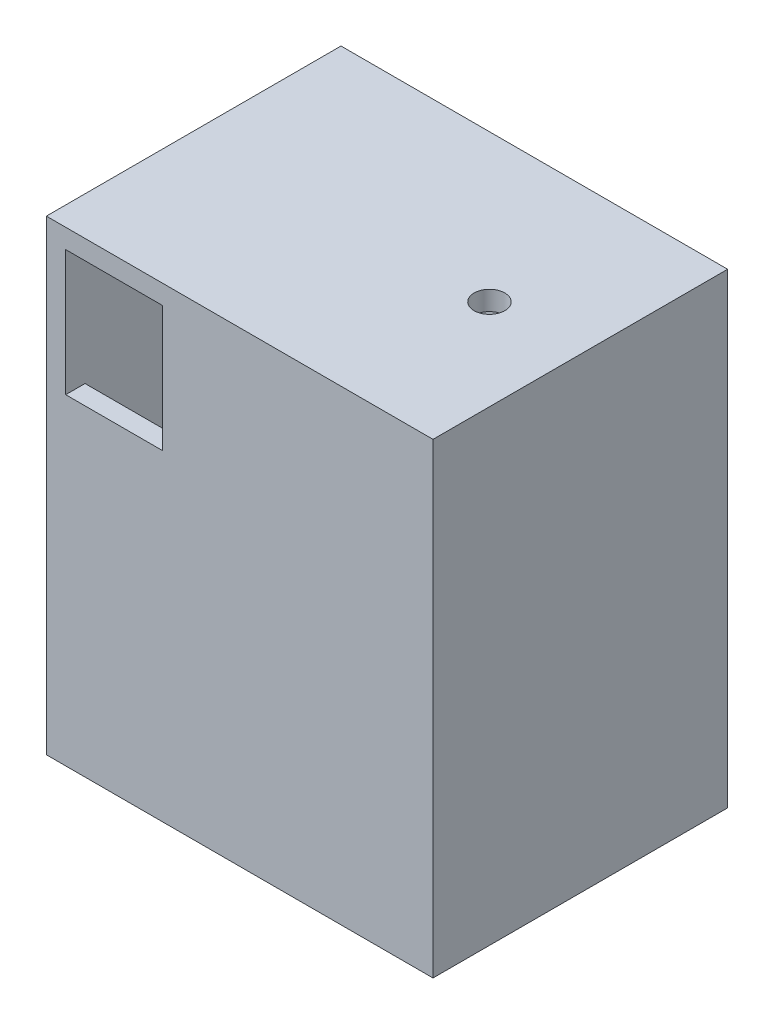
ISO-10303-21;
HEADER;
FILE_DESCRIPTION(('STEP AP214'),'2;1');
FILE_NAME('part.step','',(''),(''),'','','');
FILE_SCHEMA(('AUTOMOTIVE_DESIGN { 1 0 10303 214 1 1 1 1 }'));
ENDSEC;
DATA;
#1=APPLICATION_CONTEXT('core data for automotive mechanical design processes');
#2=APPLICATION_PROTOCOL_DEFINITION('international standard','automotive_design',2000,#1);
#3=PRODUCT_CONTEXT('',#1,'mechanical');
#4=PRODUCT('Part','Part','',(#3));
#5=PRODUCT_RELATED_PRODUCT_CATEGORY('part','',(#4));
#6=PRODUCT_DEFINITION_FORMATION('','',#4);
#7=PRODUCT_DEFINITION_CONTEXT('part definition',#1,'design');
#8=PRODUCT_DEFINITION('design','',#6,#7);
#9=PRODUCT_DEFINITION_SHAPE('','',#8);
#10=(LENGTH_UNIT() NAMED_UNIT(*) SI_UNIT(.MILLI.,.METRE.));
#11=(NAMED_UNIT(*) PLANE_ANGLE_UNIT() SI_UNIT($,.RADIAN.));
#12=(NAMED_UNIT(*) SI_UNIT($,.STERADIAN.) SOLID_ANGLE_UNIT());
#13=UNCERTAINTY_MEASURE_WITH_UNIT(LENGTH_MEASURE(1.E-05),#10,'distance_accuracy_value','');
#14=(GEOMETRIC_REPRESENTATION_CONTEXT(3) GLOBAL_UNCERTAINTY_ASSIGNED_CONTEXT((#13)) GLOBAL_UNIT_ASSIGNED_CONTEXT((#10,
#11,#12)) REPRESENTATION_CONTEXT('',''));
#15=CARTESIAN_POINT('',(0.,0.,0.));
#16=DIRECTION('',(0.,0.,1.));
#17=DIRECTION('',(1.,0.,0.));
#18=AXIS2_PLACEMENT_3D('',#15,#16,#17);
#19=CARTESIAN_POINT('',(-200.,482.6,-152.4));
#20=DIRECTION('',(0.,0.,-1.));
#21=DIRECTION('',(-1.,0.,0.));
#22=AXIS2_PLACEMENT_3D('',#19,#20,#21);
#23=PLANE('',#22);
#24=DIRECTION('',(1.,0.,0.));
#25=VECTOR('',#24,1.);
#26=CARTESIAN_POINT('',(-200.,0.,-152.4));
#27=LINE('',#26,#25);
#28=CARTESIAN_POINT('',(-200.,0.,-152.4));
#29=VERTEX_POINT('',#28);
#30=CARTESIAN_POINT('',(200.,0.,-152.4));
#31=VERTEX_POINT('',#30);
#32=EDGE_CURVE('E197',#29,#31,#27,.T.);
#33=ORIENTED_EDGE('',*,*,#32,.F.);
#34=DIRECTION('',(0.,-1.,0.));
#35=VECTOR('',#34,1.);
#36=CARTESIAN_POINT('',(-200.,482.6,-152.4));
#37=LINE('',#36,#35);
#38=CARTESIAN_POINT('',(-200.,482.6,-152.4));
#39=VERTEX_POINT('',#38);
#40=EDGE_CURVE('E219',#39,#29,#37,.T.);
#41=ORIENTED_EDGE('',*,*,#40,.F.);
#42=DIRECTION('',(1.,0.,0.));
#43=VECTOR('',#42,1.);
#44=CARTESIAN_POINT('',(-200.,482.6,-152.4));
#45=LINE('',#44,#43);
#46=CARTESIAN_POINT('',(200.,482.6,-152.4));
#47=VERTEX_POINT('',#46);
#48=EDGE_CURVE('E198',#39,#47,#45,.T.);
#49=ORIENTED_EDGE('',*,*,#48,.T.);
#50=DIRECTION('',(0.,-1.,0.));
#51=VECTOR('',#50,1.);
#52=CARTESIAN_POINT('',(200.,482.6,-152.4));
#53=LINE('',#52,#51);
#54=EDGE_CURVE('E209',#47,#31,#53,.T.);
#55=ORIENTED_EDGE('',*,*,#54,.T.);
#56=EDGE_LOOP('',(#33,#41,#49,#55));
#57=FACE_BOUND('',#56,.T.);
#58=ADVANCED_FACE('F35',(#57),#23,.T.);
#59=CARTESIAN_POINT('',(-200.,482.6,-152.4));
#60=DIRECTION('',(1.,0.,0.));
#61=DIRECTION('',(0.,0.,-1.));
#62=AXIS2_PLACEMENT_3D('',#59,#60,#61);
#63=PLANE('',#62);
#64=DIRECTION('',(0.,0.,1.));
#65=VECTOR('',#64,1.);
#66=CARTESIAN_POINT('',(-200.,0.,-152.4));
#67=LINE('',#66,#65);
#68=CARTESIAN_POINT('',(-200.,0.,152.4));
#69=VERTEX_POINT('',#68);
#70=EDGE_CURVE('E202',#29,#69,#67,.T.);
#71=ORIENTED_EDGE('',*,*,#70,.T.);
#72=DIRECTION('',(0.,-1.,0.));
#73=VECTOR('',#72,1.);
#74=CARTESIAN_POINT('',(-200.,482.6,152.4));
#75=LINE('',#74,#73);
#76=CARTESIAN_POINT('',(-200.,482.6,152.4));
#77=VERTEX_POINT('',#76);
#78=EDGE_CURVE('E222',#77,#69,#75,.T.);
#79=ORIENTED_EDGE('',*,*,#78,.F.);
#80=DIRECTION('',(0.,0.,1.));
#81=VECTOR('',#80,1.);
#82=CARTESIAN_POINT('',(-200.,482.6,-152.4));
#83=LINE('',#82,#81);
#84=EDGE_CURVE('E207',#39,#77,#83,.T.);
#85=ORIENTED_EDGE('',*,*,#84,.F.);
#86=ORIENTED_EDGE('',*,*,#40,.T.);
#87=EDGE_LOOP('',(#71,#79,#85,#86));
#88=FACE_BOUND('',#87,.T.);
#89=ADVANCED_FACE('F282',(#88),#63,.F.);
#90=CARTESIAN_POINT('',(-200.,482.6,152.4));
#91=DIRECTION('',(0.,0.,-1.));
#92=DIRECTION('',(-1.,0.,0.));
#93=AXIS2_PLACEMENT_3D('',#90,#91,#92);
#94=PLANE('',#93);
#95=DIRECTION('',(1.,0.,0.));
#96=VECTOR('',#95,1.);
#97=CARTESIAN_POINT('',(-180.,332.6,152.4));
#98=LINE('',#97,#96);
#99=CARTESIAN_POINT('',(-180.,332.6,152.4));
#100=VERTEX_POINT('',#99);
#101=CARTESIAN_POINT('',(-80.,332.6,152.4));
#102=VERTEX_POINT('',#101);
#103=EDGE_CURVE('E172',#100,#102,#98,.T.);
#104=ORIENTED_EDGE('',*,*,#103,.F.);
#105=DIRECTION('',(0.,-1.,0.));
#106=VECTOR('',#105,1.);
#107=CARTESIAN_POINT('',(-180.,462.6,152.4));
#108=LINE('',#107,#106);
#109=CARTESIAN_POINT('',(-180.,462.6,152.4));
#110=VERTEX_POINT('',#109);
#111=EDGE_CURVE('E168',#110,#100,#108,.T.);
#112=ORIENTED_EDGE('',*,*,#111,.F.);
#113=DIRECTION('',(-1.,0.,0.));
#114=VECTOR('',#113,1.);
#115=CARTESIAN_POINT('',(-180.,462.6,152.4));
#116=LINE('',#115,#114);
#117=CARTESIAN_POINT('',(-80.,462.6,152.4));
#118=VERTEX_POINT('',#117);
#119=EDGE_CURVE('E178',#118,#110,#116,.T.);
#120=ORIENTED_EDGE('',*,*,#119,.F.);
#121=DIRECTION('',(0.,1.,0.));
#122=VECTOR('',#121,1.);
#123=CARTESIAN_POINT('',(-80.,462.6,152.4));
#124=LINE('',#123,#122);
#125=EDGE_CURVE('E175',#102,#118,#124,.T.);
#126=ORIENTED_EDGE('',*,*,#125,.F.);
#127=EDGE_LOOP('',(#104,#112,#120,#126));
#128=FACE_BOUND('',#127,.T.);
#129=DIRECTION('',(1.,0.,0.));
#130=VECTOR('',#129,1.);
#131=CARTESIAN_POINT('',(-200.,0.,152.4));
#132=LINE('',#131,#130);
#133=CARTESIAN_POINT('',(200.,0.,152.4));
#134=VERTEX_POINT('',#133);
#135=EDGE_CURVE('E215',#69,#134,#132,.T.);
#136=ORIENTED_EDGE('',*,*,#135,.T.);
#137=DIRECTION('',(0.,-1.,0.));
#138=VECTOR('',#137,1.);
#139=CARTESIAN_POINT('',(200.,482.6,152.4));
#140=LINE('',#139,#138);
#141=CARTESIAN_POINT('',(200.,482.6,152.4));
#142=VERTEX_POINT('',#141);
#143=EDGE_CURVE('E225',#142,#134,#140,.T.);
#144=ORIENTED_EDGE('',*,*,#143,.F.);
#145=DIRECTION('',(1.,0.,0.));
#146=VECTOR('',#145,1.);
#147=CARTESIAN_POINT('',(-200.,482.6,152.4));
#148=LINE('',#147,#146);
#149=EDGE_CURVE('E205',#77,#142,#148,.T.);
#150=ORIENTED_EDGE('',*,*,#149,.F.);
#151=ORIENTED_EDGE('',*,*,#78,.T.);
#152=EDGE_LOOP('',(#136,#144,#150,#151));
#153=FACE_BOUND('',#152,.T.);
#154=ADVANCED_FACE('F288',(#128,#153),#94,.F.);
#155=CARTESIAN_POINT('',(200.,482.6,-152.4));
#156=DIRECTION('',(1.,0.,0.));
#157=DIRECTION('',(0.,0.,-1.));
#158=AXIS2_PLACEMENT_3D('',#155,#156,#157);
#159=PLANE('',#158);
#160=DIRECTION('',(0.,0.,1.));
#161=VECTOR('',#160,1.);
#162=CARTESIAN_POINT('',(200.,0.,-152.4));
#163=LINE('',#162,#161);
#164=EDGE_CURVE('E212',#31,#134,#163,.T.);
#165=ORIENTED_EDGE('',*,*,#164,.F.);
#166=ORIENTED_EDGE('',*,*,#54,.F.);
#167=DIRECTION('',(0.,0.,1.));
#168=VECTOR('',#167,1.);
#169=CARTESIAN_POINT('',(200.,482.6,-152.4));
#170=LINE('',#169,#168);
#171=EDGE_CURVE('E201',#47,#142,#170,.T.);
#172=ORIENTED_EDGE('',*,*,#171,.T.);
#173=ORIENTED_EDGE('',*,*,#143,.T.);
#174=EDGE_LOOP('',(#165,#166,#172,#173));
#175=FACE_BOUND('',#174,.T.);
#176=ADVANCED_FACE('F294',(#175),#159,.T.);
#177=CARTESIAN_POINT('',(0.,482.6,0.));
#178=DIRECTION('',(0.,-1.,0.));
#179=DIRECTION('',(0.,0.,-1.));
#180=AXIS2_PLACEMENT_3D('',#177,#178,#179);
#181=PLANE('',#180);
#182=CARTESIAN_POINT('',(106.,482.6,0.));
#183=DIRECTION('',(0.,1.,0.));
#184=DIRECTION('',(0.,0.,1.));
#185=AXIS2_PLACEMENT_3D('',#182,#183,#184);
#186=CIRCLE('',#185,15.9047003075628);
#187=CARTESIAN_POINT('',(106.,482.6,15.9047003075628));
#188=VERTEX_POINT('',#187);
#189=EDGE_CURVE('E194',#188,#188,#186,.T.);
#190=ORIENTED_EDGE('',*,*,#189,.F.);
#191=EDGE_LOOP('',(#190));
#192=FACE_BOUND('',#191,.T.);
#193=ORIENTED_EDGE('',*,*,#48,.F.);
#194=ORIENTED_EDGE('',*,*,#84,.T.);
#195=ORIENTED_EDGE('',*,*,#149,.T.);
#196=ORIENTED_EDGE('',*,*,#171,.F.);
#197=EDGE_LOOP('',(#193,#194,#195,#196));
#198=FACE_BOUND('',#197,.T.);
#199=ADVANCED_FACE('F328',(#192,#198),#181,.F.);
#200=CARTESIAN_POINT('',(0.,0.,0.));
#201=DIRECTION('',(0.,-1.,0.));
#202=DIRECTION('',(0.,0.,-1.));
#203=AXIS2_PLACEMENT_3D('',#200,#201,#202);
#204=PLANE('',#203);
#205=DIRECTION('',(0.,0.,1.));
#206=VECTOR('',#205,1.);
#207=CARTESIAN_POINT('',(-30.,0.,40.));
#208=LINE('',#207,#206);
#209=CARTESIAN_POINT('',(-30.,0.,-40.));
#210=VERTEX_POINT('',#209);
#211=CARTESIAN_POINT('',(-30.,0.,40.));
#212=VERTEX_POINT('',#211);
#213=EDGE_CURVE('E50',#210,#212,#208,.T.);
#214=ORIENTED_EDGE('',*,*,#213,.F.);
#215=DIRECTION('',(1.,0.,0.));
#216=VECTOR('',#215,1.);
#217=CARTESIAN_POINT('',(-90.,0.,-40.));
#218=LINE('',#217,#216);
#219=CARTESIAN_POINT('',(-90.,0.,-40.));
#220=VERTEX_POINT('',#219);
#221=EDGE_CURVE('E161',#220,#210,#218,.T.);
#222=ORIENTED_EDGE('',*,*,#221,.F.);
#223=DIRECTION('',(0.,0.,-1.));
#224=VECTOR('',#223,1.);
#225=CARTESIAN_POINT('',(-90.,0.,40.));
#226=LINE('',#225,#224);
#227=CARTESIAN_POINT('',(-90.,0.,40.));
#228=VERTEX_POINT('',#227);
#229=EDGE_CURVE('E145',#228,#220,#226,.T.);
#230=ORIENTED_EDGE('',*,*,#229,.F.);
#231=DIRECTION('',(-1.,0.,0.));
#232=VECTOR('',#231,1.);
#233=CARTESIAN_POINT('',(-90.,0.,40.));
#234=LINE('',#233,#232);
#235=EDGE_CURVE('E154',#212,#228,#234,.T.);
#236=ORIENTED_EDGE('',*,*,#235,.F.);
#237=EDGE_LOOP('',(#214,#222,#230,#236));
#238=FACE_BOUND('',#237,.T.);
#239=ORIENTED_EDGE('',*,*,#32,.T.);
#240=ORIENTED_EDGE('',*,*,#164,.T.);
#241=ORIENTED_EDGE('',*,*,#135,.F.);
#242=ORIENTED_EDGE('',*,*,#70,.F.);
#243=EDGE_LOOP('',(#239,#240,#241,#242));
#244=FACE_BOUND('',#243,.T.);
#245=ADVANCED_FACE('F158',(#238,#244),#204,.T.);
#246=CARTESIAN_POINT('',(106.,-0.000999999999973245,0.));
#247=DIRECTION('',(0.,1.,0.));
#248=DIRECTION('',(0.,0.,1.));
#249=AXIS2_PLACEMENT_3D('',#246,#247,#248);
#250=CYLINDRICAL_SURFACE('',#249,15.9047003075628);
#251=CARTESIAN_POINT('',(106.,462.6,0.));
#252=DIRECTION('',(0.,-1.,0.));
#253=DIRECTION('',(0.,0.,-1.));
#254=AXIS2_PLACEMENT_3D('',#251,#252,#253);
#255=CIRCLE('',#254,15.9047003075628);
#256=CARTESIAN_POINT('',(106.,462.6,15.9047003075628));
#257=VERTEX_POINT('',#256);
#258=EDGE_CURVE('E191',#257,#257,#255,.F.);
#259=CARTESIAN_POINT('',(106.,462.6,15.9047003075628));
#260=CARTESIAN_POINT('',(106.,462.808333333333,15.9047003075628));
#261=CARTESIAN_POINT('',(106.,463.016666666667,15.9047003075628));
#262=CARTESIAN_POINT('',(106.,463.433333333333,15.9047003075628));
#263=CARTESIAN_POINT('',(106.,463.641666666667,15.9047003075628));
#264=CARTESIAN_POINT('',(106.,464.058333333333,15.9047003075628));
#265=CARTESIAN_POINT('',(106.,464.266666666667,15.9047003075628));
#266=CARTESIAN_POINT('',(106.,464.683333333333,15.9047003075628));
#267=CARTESIAN_POINT('',(106.,464.891666666667,15.9047003075628));
#268=CARTESIAN_POINT('',(106.,465.308333333333,15.9047003075628));
#269=CARTESIAN_POINT('',(106.,465.516666666667,15.9047003075628));
#270=CARTESIAN_POINT('',(106.,465.933333333333,15.9047003075628));
#271=CARTESIAN_POINT('',(106.,466.141666666667,15.9047003075628));
#272=CARTESIAN_POINT('',(106.,466.558333333333,15.9047003075628));
#273=CARTESIAN_POINT('',(106.,466.766666666667,15.9047003075628));
#274=CARTESIAN_POINT('',(106.,467.183333333333,15.9047003075628));
#275=CARTESIAN_POINT('',(106.,467.391666666667,15.9047003075628));
#276=CARTESIAN_POINT('',(106.,467.808333333333,15.9047003075628));
#277=CARTESIAN_POINT('',(106.,468.016666666667,15.9047003075628));
#278=CARTESIAN_POINT('',(106.,468.433333333333,15.9047003075628));
#279=CARTESIAN_POINT('',(106.,468.641666666667,15.9047003075628));
#280=CARTESIAN_POINT('',(106.,469.058333333333,15.9047003075628));
#281=CARTESIAN_POINT('',(106.,469.266666666667,15.9047003075628));
#282=CARTESIAN_POINT('',(106.,469.683333333333,15.9047003075628));
#283=CARTESIAN_POINT('',(106.,469.891666666667,15.9047003075628));
#284=CARTESIAN_POINT('',(106.,470.308333333333,15.9047003075628));
#285=CARTESIAN_POINT('',(106.,470.516666666667,15.9047003075628));
#286=CARTESIAN_POINT('',(106.,470.933333333333,15.9047003075628));
#287=CARTESIAN_POINT('',(106.,471.141666666667,15.9047003075628));
#288=CARTESIAN_POINT('',(106.,471.558333333333,15.9047003075628));
#289=CARTESIAN_POINT('',(106.,471.766666666667,15.9047003075628));
#290=CARTESIAN_POINT('',(106.,472.183333333333,15.9047003075628));
#291=CARTESIAN_POINT('',(106.,472.391666666667,15.9047003075628));
#292=CARTESIAN_POINT('',(106.,472.808333333333,15.9047003075628));
#293=CARTESIAN_POINT('',(106.,473.016666666667,15.9047003075628));
#294=CARTESIAN_POINT('',(106.,473.433333333333,15.9047003075628));
#295=CARTESIAN_POINT('',(106.,473.641666666667,15.9047003075628));
#296=CARTESIAN_POINT('',(106.,474.058333333333,15.9047003075628));
#297=CARTESIAN_POINT('',(106.,474.266666666667,15.9047003075628));
#298=CARTESIAN_POINT('',(106.,474.683333333333,15.9047003075628));
#299=CARTESIAN_POINT('',(106.,474.891666666667,15.9047003075628));
#300=CARTESIAN_POINT('',(106.,475.308333333333,15.9047003075628));
#301=CARTESIAN_POINT('',(106.,475.516666666667,15.9047003075628));
#302=CARTESIAN_POINT('',(106.,475.933333333333,15.9047003075628));
#303=CARTESIAN_POINT('',(106.,476.141666666667,15.9047003075628));
#304=CARTESIAN_POINT('',(106.,476.558333333333,15.9047003075628));
#305=CARTESIAN_POINT('',(106.,476.766666666667,15.9047003075628));
#306=CARTESIAN_POINT('',(106.,477.183333333333,15.9047003075628));
#307=CARTESIAN_POINT('',(106.,477.391666666667,15.9047003075628));
#308=CARTESIAN_POINT('',(106.,477.808333333333,15.9047003075628));
#309=CARTESIAN_POINT('',(106.,478.016666666667,15.9047003075628));
#310=CARTESIAN_POINT('',(106.,478.433333333333,15.9047003075628));
#311=CARTESIAN_POINT('',(106.,478.641666666667,15.9047003075628));
#312=CARTESIAN_POINT('',(106.,479.058333333333,15.9047003075628));
#313=CARTESIAN_POINT('',(106.,479.266666666667,15.9047003075628));
#314=CARTESIAN_POINT('',(106.,479.683333333333,15.9047003075628));
#315=CARTESIAN_POINT('',(106.,479.891666666667,15.9047003075628));
#316=CARTESIAN_POINT('',(106.,480.308333333333,15.9047003075628));
#317=CARTESIAN_POINT('',(106.,480.516666666667,15.9047003075628));
#318=CARTESIAN_POINT('',(106.,480.933333333333,15.9047003075628));
#319=CARTESIAN_POINT('',(106.,481.141666666667,15.9047003075628));
#320=CARTESIAN_POINT('',(106.,481.558333333333,15.9047003075628));
#321=CARTESIAN_POINT('',(106.,481.766666666667,15.9047003075628));
#322=CARTESIAN_POINT('',(106.,482.183333333333,15.9047003075628));
#323=CARTESIAN_POINT('',(106.,482.391666666667,15.9047003075628));
#324=CARTESIAN_POINT('',(106.,482.6,15.9047003075628));
#325=B_SPLINE_CURVE_WITH_KNOTS('',3,(#259,#260,#261,#262,#263,#264,#265,#266,#267,#268,#269,
#270,#271,#272,#273,#274,#275,#276,#277,#278,#279,#280,#281,#282,#283,#284,#285,#286,#287,#288,
#289,#290,#291,#292,#293,#294,#295,#296,#297,#298,#299,#300,#301,#302,#303,#304,#305,#306,#307,
#308,#309,#310,#311,#312,#313,#314,#315,#316,#317,#318,#319,#320,#321,#322,#323,#324),
.UNSPECIFIED.,.F.,.F.,(4,2,2,2,2,2,2,2,2,2,2,2,2,2,2,2,2,2,2,2,2,2,2,2,2,2,2,2,2,2,2,2,4),(0.,
0.624999999999987,1.24999999999997,1.87500000000002,2.5,3.12499999999999,3.75000000000003,
4.37500000000002,5.,5.62499999999999,6.24999999999998,6.87500000000002,7.50000000000001,
8.12499999999999,8.75000000000004,9.37500000000002,10.,10.625,11.25,11.875,12.5,13.125,13.75,
14.375,15.,15.625,16.25,16.875,17.5,18.125,18.75,19.375,20.),.UNSPECIFIED.);
#326=EDGE_CURVE('BSEAM300',#257,#188,#325,.T.);
#327=ORIENTED_EDGE('',*,*,#258,.F.);
#328=ORIENTED_EDGE('',*,*,#189,.T.);
#329=ORIENTED_EDGE('',*,*,#326,.T.);
#330=ORIENTED_EDGE('',*,*,#326,.F.);
#331=EDGE_LOOP('',(#327,#329,#328,#330));
#332=FACE_BOUND('',#331,.T.);
#333=ADVANCED_FACE('F300',(#332),#250,.F.);
#334=CARTESIAN_POINT('',(-200.,482.6,-132.4));
#335=DIRECTION('',(0.,0.,-1.));
#336=DIRECTION('',(-1.,0.,0.));
#337=AXIS2_PLACEMENT_3D('',#334,#335,#336);
#338=PLANE('',#337);
#339=DIRECTION('',(1.,0.,0.));
#340=VECTOR('',#339,1.);
#341=CARTESIAN_POINT('',(0.,20.,-132.4));
#342=LINE('',#341,#340);
#343=CARTESIAN_POINT('',(-180.,20.,-132.4));
#344=VERTEX_POINT('',#343);
#345=CARTESIAN_POINT('',(180.,20.,-132.4));
#346=VERTEX_POINT('',#345);
#347=EDGE_CURVE('E232',#344,#346,#342,.T.);
#348=ORIENTED_EDGE('',*,*,#347,.T.);
#349=DIRECTION('',(0.,-1.,0.));
#350=VECTOR('',#349,1.);
#351=CARTESIAN_POINT('',(180.,482.6,-132.4));
#352=LINE('',#351,#350);
#353=CARTESIAN_POINT('',(180.,462.6,-132.4));
#354=VERTEX_POINT('',#353);
#355=EDGE_CURVE('E254',#354,#346,#352,.T.);
#356=ORIENTED_EDGE('',*,*,#355,.F.);
#357=DIRECTION('',(1.,0.,0.));
#358=VECTOR('',#357,1.);
#359=CARTESIAN_POINT('',(0.,462.6,-132.4));
#360=LINE('',#359,#358);
#361=CARTESIAN_POINT('',(-180.,462.6,-132.4));
#362=VERTEX_POINT('',#361);
#363=EDGE_CURVE('E221',#362,#354,#360,.T.);
#364=ORIENTED_EDGE('',*,*,#363,.F.);
#365=DIRECTION('',(0.,-1.,0.));
#366=VECTOR('',#365,1.);
#367=CARTESIAN_POINT('',(-180.,482.6,-132.4));
#368=LINE('',#367,#366);
#369=EDGE_CURVE('E249',#362,#344,#368,.T.);
#370=ORIENTED_EDGE('',*,*,#369,.T.);
#371=EDGE_LOOP('',(#348,#356,#364,#370));
#372=FACE_BOUND('',#371,.T.);
#373=ADVANCED_FACE('F296',(#372),#338,.F.);
#374=CARTESIAN_POINT('',(-180.,482.6,-152.4));
#375=DIRECTION('',(1.,0.,0.));
#376=DIRECTION('',(0.,0.,-1.));
#377=AXIS2_PLACEMENT_3D('',#374,#375,#376);
#378=PLANE('',#377);
#379=DIRECTION('',(0.,0.,1.));
#380=VECTOR('',#379,1.);
#381=CARTESIAN_POINT('',(-180.,332.6,102.4));
#382=LINE('',#381,#380);
#383=CARTESIAN_POINT('',(-180.,332.6,132.4));
#384=VERTEX_POINT('',#383);
#385=EDGE_CURVE('E181',#384,#100,#382,.T.);
#386=ORIENTED_EDGE('',*,*,#385,.F.);
#387=DIRECTION('',(0.,-1.,0.));
#388=VECTOR('',#387,1.);
#389=CARTESIAN_POINT('',(-180.,482.6,132.4));
#390=LINE('',#389,#388);
#391=CARTESIAN_POINT('',(-180.,20.,132.4));
#392=VERTEX_POINT('',#391);
#393=EDGE_CURVE('E244',#384,#392,#390,.T.);
#394=ORIENTED_EDGE('',*,*,#393,.T.);
#395=DIRECTION('',(0.,0.,1.));
#396=VECTOR('',#395,1.);
#397=CARTESIAN_POINT('',(-180.,20.,0.));
#398=LINE('',#397,#396);
#399=EDGE_CURVE('E251',#344,#392,#398,.T.);
#400=ORIENTED_EDGE('',*,*,#399,.F.);
#401=ORIENTED_EDGE('',*,*,#369,.F.);
#402=DIRECTION('',(0.,0.,1.));
#403=VECTOR('',#402,1.);
#404=CARTESIAN_POINT('',(-180.,462.6,0.));
#405=LINE('',#404,#403);
#406=EDGE_CURVE('E237',#362,#110,#405,.T.);
#407=ORIENTED_EDGE('',*,*,#406,.T.);
#408=ORIENTED_EDGE('',*,*,#111,.T.);
#409=EDGE_LOOP('',(#386,#394,#400,#401,#407,#408));
#410=FACE_BOUND('',#409,.T.);
#411=ADVANCED_FACE('F299',(#410),#378,.T.);
#412=CARTESIAN_POINT('',(-200.,482.6,132.4));
#413=DIRECTION('',(0.,0.,-1.));
#414=DIRECTION('',(-1.,0.,0.));
#415=AXIS2_PLACEMENT_3D('',#412,#413,#414);
#416=PLANE('',#415);
#417=DIRECTION('',(0.,-1.,0.));
#418=VECTOR('',#417,1.);
#419=CARTESIAN_POINT('',(-80.,482.6,132.4));
#420=LINE('',#419,#418);
#421=CARTESIAN_POINT('',(-80.,462.6,132.4));
#422=VERTEX_POINT('',#421);
#423=CARTESIAN_POINT('',(-80.,332.6,132.4));
#424=VERTEX_POINT('',#423);
#425=EDGE_CURVE('E184',#422,#424,#420,.T.);
#426=ORIENTED_EDGE('',*,*,#425,.F.);
#427=DIRECTION('',(1.,0.,0.));
#428=VECTOR('',#427,1.);
#429=CARTESIAN_POINT('',(0.,462.6,132.4));
#430=LINE('',#429,#428);
#431=CARTESIAN_POINT('',(180.,462.6,132.4));
#432=VERTEX_POINT('',#431);
#433=EDGE_CURVE('E235',#422,#432,#430,.T.);
#434=ORIENTED_EDGE('',*,*,#433,.T.);
#435=DIRECTION('',(0.,-1.,0.));
#436=VECTOR('',#435,1.);
#437=CARTESIAN_POINT('',(180.,482.6,132.4));
#438=LINE('',#437,#436);
#439=CARTESIAN_POINT('',(180.,20.,132.4));
#440=VERTEX_POINT('',#439);
#441=EDGE_CURVE('E239',#432,#440,#438,.T.);
#442=ORIENTED_EDGE('',*,*,#441,.T.);
#443=DIRECTION('',(1.,0.,0.));
#444=VECTOR('',#443,1.);
#445=CARTESIAN_POINT('',(0.,20.,132.4));
#446=LINE('',#445,#444);
#447=EDGE_CURVE('E246',#392,#440,#446,.T.);
#448=ORIENTED_EDGE('',*,*,#447,.F.);
#449=ORIENTED_EDGE('',*,*,#393,.F.);
#450=DIRECTION('',(-1.,0.,0.));
#451=VECTOR('',#450,1.);
#452=CARTESIAN_POINT('',(-200.,332.6,132.4));
#453=LINE('',#452,#451);
#454=EDGE_CURVE('E231',#424,#384,#453,.T.);
#455=ORIENTED_EDGE('',*,*,#454,.F.);
#456=EDGE_LOOP('',(#426,#434,#442,#448,#449,#455));
#457=FACE_BOUND('',#456,.T.);
#458=ADVANCED_FACE('F304',(#457),#416,.T.);
#459=CARTESIAN_POINT('',(180.,482.6,-152.4));
#460=DIRECTION('',(1.,0.,0.));
#461=DIRECTION('',(0.,0.,-1.));
#462=AXIS2_PLACEMENT_3D('',#459,#460,#461);
#463=PLANE('',#462);
#464=DIRECTION('',(0.,0.,1.));
#465=VECTOR('',#464,1.);
#466=CARTESIAN_POINT('',(180.,20.,0.));
#467=LINE('',#466,#465);
#468=EDGE_CURVE('E228',#346,#440,#467,.T.);
#469=ORIENTED_EDGE('',*,*,#468,.T.);
#470=ORIENTED_EDGE('',*,*,#441,.F.);
#471=DIRECTION('',(0.,0.,1.));
#472=VECTOR('',#471,1.);
#473=CARTESIAN_POINT('',(180.,462.6,0.));
#474=LINE('',#473,#472);
#475=EDGE_CURVE('E241',#354,#432,#474,.T.);
#476=ORIENTED_EDGE('',*,*,#475,.F.);
#477=ORIENTED_EDGE('',*,*,#355,.T.);
#478=EDGE_LOOP('',(#469,#470,#476,#477));
#479=FACE_BOUND('',#478,.T.);
#480=ADVANCED_FACE('F308',(#479),#463,.F.);
#481=CARTESIAN_POINT('',(0.,462.6,0.));
#482=DIRECTION('',(0.,-1.,0.));
#483=DIRECTION('',(0.,0.,-1.));
#484=AXIS2_PLACEMENT_3D('',#481,#482,#483);
#485=PLANE('',#484);
#486=ORIENTED_EDGE('',*,*,#433,.F.);
#487=DIRECTION('',(0.,0.,1.));
#488=VECTOR('',#487,1.);
#489=CARTESIAN_POINT('',(-80.,462.6,102.4));
#490=LINE('',#489,#488);
#491=EDGE_CURVE('E182',#422,#118,#490,.T.);
#492=ORIENTED_EDGE('',*,*,#491,.T.);
#493=ORIENTED_EDGE('',*,*,#119,.T.);
#494=ORIENTED_EDGE('',*,*,#406,.F.);
#495=ORIENTED_EDGE('',*,*,#363,.T.);
#496=ORIENTED_EDGE('',*,*,#475,.T.);
#497=EDGE_LOOP('',(#486,#492,#493,#494,#495,#496));
#498=FACE_BOUND('',#497,.T.);
#499=ORIENTED_EDGE('',*,*,#258,.T.);
#500=EDGE_LOOP('',(#499));
#501=FACE_BOUND('',#500,.T.);
#502=ADVANCED_FACE('F311',(#498,#501),#485,.T.);
#503=CARTESIAN_POINT('',(0.,20.,0.));
#504=DIRECTION('',(0.,-1.,0.));
#505=DIRECTION('',(0.,0.,-1.));
#506=AXIS2_PLACEMENT_3D('',#503,#504,#505);
#507=PLANE('',#506);
#508=DIRECTION('',(1.,0.,0.));
#509=VECTOR('',#508,1.);
#510=CARTESIAN_POINT('',(0.,20.,-40.));
#511=LINE('',#510,#509);
#512=CARTESIAN_POINT('',(-90.,20.,-40.));
#513=VERTEX_POINT('',#512);
#514=CARTESIAN_POINT('',(-30.,20.,-40.));
#515=VERTEX_POINT('',#514);
#516=EDGE_CURVE('E43',#513,#515,#511,.T.);
#517=ORIENTED_EDGE('',*,*,#516,.T.);
#518=DIRECTION('',(0.,0.,1.));
#519=VECTOR('',#518,1.);
#520=CARTESIAN_POINT('',(-30.,20.,0.));
#521=LINE('',#520,#519);
#522=CARTESIAN_POINT('',(-30.,20.,40.));
#523=VERTEX_POINT('',#522);
#524=EDGE_CURVE('E11',#515,#523,#521,.T.);
#525=ORIENTED_EDGE('',*,*,#524,.T.);
#526=DIRECTION('',(-1.,0.,0.));
#527=VECTOR('',#526,1.);
#528=CARTESIAN_POINT('',(0.,20.,40.));
#529=LINE('',#528,#527);
#530=CARTESIAN_POINT('',(-90.,20.,40.));
#531=VERTEX_POINT('',#530);
#532=EDGE_CURVE('E259',#523,#531,#529,.T.);
#533=ORIENTED_EDGE('',*,*,#532,.T.);
#534=DIRECTION('',(0.,0.,-1.));
#535=VECTOR('',#534,1.);
#536=CARTESIAN_POINT('',(-90.,20.,0.));
#537=LINE('',#536,#535);
#538=EDGE_CURVE('E148',#531,#513,#537,.T.);
#539=ORIENTED_EDGE('',*,*,#538,.T.);
#540=EDGE_LOOP('',(#517,#525,#533,#539));
#541=FACE_BOUND('',#540,.T.);
#542=ORIENTED_EDGE('',*,*,#347,.F.);
#543=ORIENTED_EDGE('',*,*,#399,.T.);
#544=ORIENTED_EDGE('',*,*,#447,.T.);
#545=ORIENTED_EDGE('',*,*,#468,.F.);
#546=EDGE_LOOP('',(#542,#543,#544,#545));
#547=FACE_BOUND('',#546,.T.);
#548=ADVANCED_FACE('F37',(#541,#547),#507,.F.);
#549=CARTESIAN_POINT('',(-80.,462.6,102.4));
#550=DIRECTION('',(1.,0.,0.));
#551=DIRECTION('',(0.,0.,-1.));
#552=AXIS2_PLACEMENT_3D('',#549,#550,#551);
#553=PLANE('',#552);
#554=ORIENTED_EDGE('',*,*,#425,.T.);
#555=DIRECTION('',(0.,0.,1.));
#556=VECTOR('',#555,1.);
#557=CARTESIAN_POINT('',(-80.,332.6,102.4));
#558=LINE('',#557,#556);
#559=EDGE_CURVE('E185',#424,#102,#558,.T.);
#560=ORIENTED_EDGE('',*,*,#559,.T.);
#561=ORIENTED_EDGE('',*,*,#125,.T.);
#562=ORIENTED_EDGE('',*,*,#491,.F.);
#563=EDGE_LOOP('',(#554,#560,#561,#562));
#564=FACE_BOUND('',#563,.T.);
#565=ADVANCED_FACE('F276',(#564),#553,.F.);
#566=CARTESIAN_POINT('',(-180.,332.6,102.4));
#567=DIRECTION('',(0.,-1.,0.));
#568=DIRECTION('',(0.,0.,-1.));
#569=AXIS2_PLACEMENT_3D('',#566,#567,#568);
#570=PLANE('',#569);
#571=ORIENTED_EDGE('',*,*,#454,.T.);
#572=ORIENTED_EDGE('',*,*,#385,.T.);
#573=ORIENTED_EDGE('',*,*,#103,.T.);
#574=ORIENTED_EDGE('',*,*,#559,.F.);
#575=EDGE_LOOP('',(#571,#572,#573,#574));
#576=FACE_BOUND('',#575,.T.);
#577=ADVANCED_FACE('F269',(#576),#570,.F.);
#578=CARTESIAN_POINT('',(-30.,30.,40.));
#579=DIRECTION('',(1.,0.,0.));
#580=DIRECTION('',(0.,0.,-1.));
#581=AXIS2_PLACEMENT_3D('',#578,#579,#580);
#582=PLANE('',#581);
#583=DIRECTION('',(0.,-1.,0.));
#584=VECTOR('',#583,1.);
#585=CARTESIAN_POINT('',(-30.,30.,-40.));
#586=LINE('',#585,#584);
#587=EDGE_CURVE('E166',#515,#210,#586,.T.);
#588=ORIENTED_EDGE('',*,*,#587,.T.);
#589=ORIENTED_EDGE('',*,*,#213,.T.);
#590=DIRECTION('',(0.,-1.,0.));
#591=VECTOR('',#590,1.);
#592=CARTESIAN_POINT('',(-30.,30.,40.));
#593=LINE('',#592,#591);
#594=EDGE_CURVE('E151',#523,#212,#593,.T.);
#595=ORIENTED_EDGE('',*,*,#594,.F.);
#596=ORIENTED_EDGE('',*,*,#524,.F.);
#597=EDGE_LOOP('',(#588,#589,#595,#596));
#598=FACE_BOUND('',#597,.T.);
#599=ADVANCED_FACE('F267',(#598),#582,.F.);
#600=CARTESIAN_POINT('',(-90.,30.,-40.));
#601=DIRECTION('',(0.,0.,-1.));
#602=DIRECTION('',(-1.,0.,0.));
#603=AXIS2_PLACEMENT_3D('',#600,#601,#602);
#604=PLANE('',#603);
#605=DIRECTION('',(0.,-1.,0.));
#606=VECTOR('',#605,1.);
#607=CARTESIAN_POINT('',(-90.,30.,-40.));
#608=LINE('',#607,#606);
#609=EDGE_CURVE('E150',#513,#220,#608,.T.);
#610=ORIENTED_EDGE('',*,*,#609,.T.);
#611=ORIENTED_EDGE('',*,*,#221,.T.);
#612=ORIENTED_EDGE('',*,*,#587,.F.);
#613=ORIENTED_EDGE('',*,*,#516,.F.);
#614=EDGE_LOOP('',(#610,#611,#612,#613));
#615=FACE_BOUND('',#614,.T.);
#616=ADVANCED_FACE('F266',(#615),#604,.F.);
#617=CARTESIAN_POINT('',(-90.,30.,40.));
#618=DIRECTION('',(-1.,0.,0.));
#619=DIRECTION('',(0.,0.,1.));
#620=AXIS2_PLACEMENT_3D('',#617,#618,#619);
#621=PLANE('',#620);
#622=DIRECTION('',(0.,-1.,0.));
#623=VECTOR('',#622,1.);
#624=CARTESIAN_POINT('',(-90.,30.,40.));
#625=LINE('',#624,#623);
#626=EDGE_CURVE('E58',#531,#228,#625,.T.);
#627=ORIENTED_EDGE('',*,*,#626,.T.);
#628=ORIENTED_EDGE('',*,*,#229,.T.);
#629=ORIENTED_EDGE('',*,*,#609,.F.);
#630=ORIENTED_EDGE('',*,*,#538,.F.);
#631=EDGE_LOOP('',(#627,#628,#629,#630));
#632=FACE_BOUND('',#631,.T.);
#633=ADVANCED_FACE('F142',(#632),#621,.F.);
#634=CARTESIAN_POINT('',(-90.,30.,40.));
#635=DIRECTION('',(0.,0.,1.));
#636=DIRECTION('',(1.,0.,0.));
#637=AXIS2_PLACEMENT_3D('',#634,#635,#636);
#638=PLANE('',#637);
#639=ORIENTED_EDGE('',*,*,#594,.T.);
#640=ORIENTED_EDGE('',*,*,#235,.T.);
#641=ORIENTED_EDGE('',*,*,#626,.F.);
#642=ORIENTED_EDGE('',*,*,#532,.F.);
#643=EDGE_LOOP('',(#639,#640,#641,#642));
#644=FACE_BOUND('',#643,.T.);
#645=ADVANCED_FACE('F155',(#644),#638,.F.);
#646=CLOSED_SHELL('',(#58,#89,#154,#176,#199,#245,#333,#373,#411,#458,#480,#502,#548,#565,#577,
#599,#616,#633,#645));
#647=MANIFOLD_SOLID_BREP('B2',#646);
#648=ADVANCED_BREP_SHAPE_REPRESENTATION('',(#18,#647),#14);
#649=SHAPE_DEFINITION_REPRESENTATION(#9,#648);
ENDSEC;
END-ISO-10303-21;
